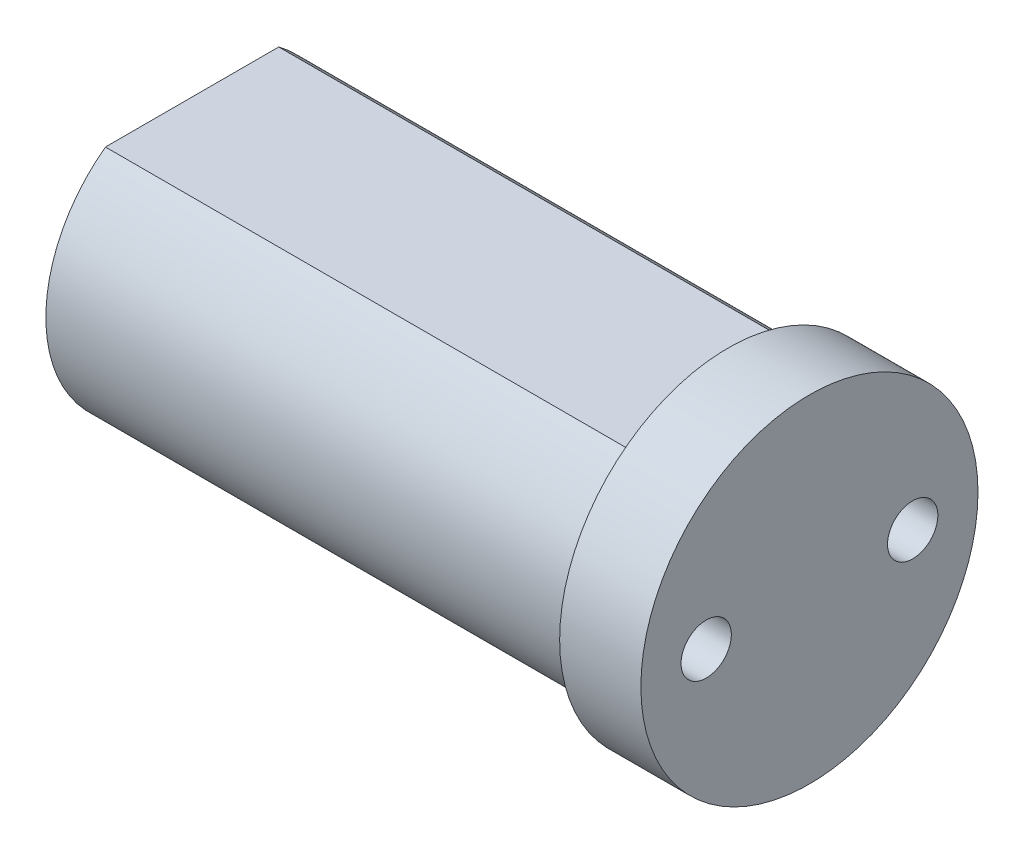
ISO-10303-21;
HEADER;
FILE_DESCRIPTION(('STEP AP214'),'2;1');
FILE_NAME('part.step','',(''),(''),'','','');
FILE_SCHEMA(('AUTOMOTIVE_DESIGN { 1 0 10303 214 1 1 1 1 }'));
ENDSEC;
DATA;
#1=APPLICATION_CONTEXT('core data for automotive mechanical design processes');
#2=APPLICATION_PROTOCOL_DEFINITION('international standard','automotive_design',2000,#1);
#3=PRODUCT_CONTEXT('',#1,'mechanical');
#4=PRODUCT('Part','Part','',(#3));
#5=PRODUCT_RELATED_PRODUCT_CATEGORY('part','',(#4));
#6=PRODUCT_DEFINITION_FORMATION('','',#4);
#7=PRODUCT_DEFINITION_CONTEXT('part definition',#1,'design');
#8=PRODUCT_DEFINITION('design','',#6,#7);
#9=PRODUCT_DEFINITION_SHAPE('','',#8);
#10=(LENGTH_UNIT() NAMED_UNIT(*) SI_UNIT(.MILLI.,.METRE.));
#11=(NAMED_UNIT(*) PLANE_ANGLE_UNIT() SI_UNIT($,.RADIAN.));
#12=(NAMED_UNIT(*) SI_UNIT($,.STERADIAN.) SOLID_ANGLE_UNIT());
#13=UNCERTAINTY_MEASURE_WITH_UNIT(LENGTH_MEASURE(1.E-05),#10,'distance_accuracy_value','');
#14=(GEOMETRIC_REPRESENTATION_CONTEXT(3) GLOBAL_UNCERTAINTY_ASSIGNED_CONTEXT((#13)) GLOBAL_UNIT_ASSIGNED_CONTEXT((#10,
#11,#12)) REPRESENTATION_CONTEXT('',''));
#15=CARTESIAN_POINT('',(0.,0.,0.));
#16=DIRECTION('',(0.,0.,1.));
#17=DIRECTION('',(1.,0.,0.));
#18=AXIS2_PLACEMENT_3D('',#15,#16,#17);
#19=CARTESIAN_POINT('',(0.,0.,0.));
#20=DIRECTION('',(1.,0.,0.));
#21=DIRECTION('',(0.,0.,-1.));
#22=AXIS2_PLACEMENT_3D('',#19,#20,#21);
#23=PLANE('',#22);
#24=CARTESIAN_POINT('',(0.,0.,0.));
#25=DIRECTION('',(1.,0.,0.));
#26=DIRECTION('',(0.,0.,-1.));
#27=AXIS2_PLACEMENT_3D('',#24,#25,#26);
#28=CIRCLE('',#27,4.15);
#29=CARTESIAN_POINT('',(0.,0.,-4.15));
#30=VERTEX_POINT('',#29);
#31=EDGE_CURVE('E38',#30,#30,#28,.T.);
#32=ORIENTED_EDGE('',*,*,#31,.F.);
#33=EDGE_LOOP('',(#32));
#34=FACE_BOUND('',#33,.T.);
#35=CARTESIAN_POINT('',(0.,0.,0.));
#36=DIRECTION('',(-1.,0.,0.));
#37=DIRECTION('',(0.,0.,-1.));
#38=AXIS2_PLACEMENT_3D('',#35,#36,#37);
#39=CIRCLE('',#38,3.6);
#40=CARTESIAN_POINT('',(0.,-2.9,2.13307290077015));
#41=VERTEX_POINT('',#40);
#42=CARTESIAN_POINT('',(0.,2.9,2.13307290077015));
#43=VERTEX_POINT('',#42);
#44=EDGE_CURVE('E49',#41,#43,#39,.T.);
#45=ORIENTED_EDGE('',*,*,#44,.F.);
#46=DIRECTION('',(0.,0.,1.));
#47=VECTOR('',#46,1.);
#48=CARTESIAN_POINT('',(0.,-2.9,2.13307290077015));
#49=LINE('',#48,#47);
#50=CARTESIAN_POINT('',(0.,-2.9,-2.13307290077015));
#51=VERTEX_POINT('',#50);
#52=EDGE_CURVE('E53',#51,#41,#49,.T.);
#53=ORIENTED_EDGE('',*,*,#52,.F.);
#54=CARTESIAN_POINT('',(0.,0.,0.));
#55=DIRECTION('',(-1.,0.,0.));
#56=DIRECTION('',(0.,0.,-1.));
#57=AXIS2_PLACEMENT_3D('',#54,#55,#56);
#58=CIRCLE('',#57,3.6);
#59=CARTESIAN_POINT('',(0.,2.9,-2.13307290077015));
#60=VERTEX_POINT('',#59);
#61=EDGE_CURVE('E105',#60,#51,#58,.T.);
#62=ORIENTED_EDGE('',*,*,#61,.F.);
#63=DIRECTION('',(0.,0.,-1.));
#64=VECTOR('',#63,1.);
#65=CARTESIAN_POINT('',(0.,2.9,2.13307290077015));
#66=LINE('',#65,#64);
#67=EDGE_CURVE('E107',#43,#60,#66,.T.);
#68=ORIENTED_EDGE('',*,*,#67,.F.);
#69=EDGE_LOOP('',(#45,#53,#62,#68));
#70=FACE_BOUND('',#69,.T.);
#71=ADVANCED_FACE('F34',(#34,#70),#23,.F.);
#72=CARTESIAN_POINT('',(2.,0.,0.));
#73=DIRECTION('',(-1.,0.,0.));
#74=DIRECTION('',(0.,0.,1.));
#75=AXIS2_PLACEMENT_3D('',#72,#73,#74);
#76=CYLINDRICAL_SURFACE('',#75,4.15);
#77=CARTESIAN_POINT('',(2.,0.,0.));
#78=DIRECTION('',(1.,0.,0.));
#79=DIRECTION('',(0.,0.,-1.));
#80=AXIS2_PLACEMENT_3D('',#77,#78,#79);
#81=CIRCLE('',#80,4.15);
#82=CARTESIAN_POINT('',(2.,0.,-4.15));
#83=VERTEX_POINT('',#82);
#84=EDGE_CURVE('E11',#83,#83,#81,.T.);
#85=ORIENTED_EDGE('',*,*,#84,.F.);
#86=EDGE_LOOP('',(#85));
#87=FACE_BOUND('',#86,.T.);
#88=ORIENTED_EDGE('',*,*,#31,.T.);
#89=EDGE_LOOP('',(#88));
#90=FACE_BOUND('',#89,.T.);
#91=ADVANCED_FACE('F36',(#87,#90),#76,.T.);
#92=CARTESIAN_POINT('',(2.,0.,0.));
#93=DIRECTION('',(1.,0.,0.));
#94=DIRECTION('',(0.,0.,-1.));
#95=AXIS2_PLACEMENT_3D('',#92,#93,#94);
#96=PLANE('',#95);
#97=CARTESIAN_POINT('',(2.,0.,2.54193322109989));
#98=DIRECTION('',(1.,0.,0.));
#99=DIRECTION('',(0.,0.,-1.));
#100=AXIS2_PLACEMENT_3D('',#97,#98,#99);
#101=CIRCLE('',#100,0.619261524829767);
#102=CARTESIAN_POINT('',(2.,0.,1.92267169627012));
#103=VERTEX_POINT('',#102);
#104=EDGE_CURVE('E116',#103,#103,#101,.T.);
#105=ORIENTED_EDGE('',*,*,#104,.F.);
#106=EDGE_LOOP('',(#105));
#107=FACE_BOUND('',#106,.T.);
#108=CARTESIAN_POINT('',(2.,0.,-2.54193322109989));
#109=DIRECTION('',(1.,0.,0.));
#110=DIRECTION('',(0.,0.,1.));
#111=AXIS2_PLACEMENT_3D('',#108,#109,#110);
#112=CIRCLE('',#111,0.619261524829767);
#113=CARTESIAN_POINT('',(2.,0.,-1.92267169627012));
#114=VERTEX_POINT('',#113);
#115=EDGE_CURVE('E117',#114,#114,#112,.T.);
#116=ORIENTED_EDGE('',*,*,#115,.F.);
#117=EDGE_LOOP('',(#116));
#118=FACE_BOUND('',#117,.T.);
#119=ORIENTED_EDGE('',*,*,#84,.T.);
#120=EDGE_LOOP('',(#119));
#121=FACE_BOUND('',#120,.T.);
#122=ADVANCED_FACE('F127',(#107,#118,#121),#96,.T.);
#123=CARTESIAN_POINT('',(-13.2,0.,0.));
#124=DIRECTION('',(1.,0.,0.));
#125=DIRECTION('',(0.,0.,-1.));
#126=AXIS2_PLACEMENT_3D('',#123,#124,#125);
#127=CYLINDRICAL_SURFACE('',#126,3.6);
#128=ORIENTED_EDGE('',*,*,#44,.T.);
#129=DIRECTION('',(1.,0.,0.));
#130=VECTOR('',#129,1.);
#131=CARTESIAN_POINT('',(-13.2,2.9,2.13307290077015));
#132=LINE('',#131,#130);
#133=CARTESIAN_POINT('',(-13.2,2.9,2.13307290077015));
#134=VERTEX_POINT('',#133);
#135=EDGE_CURVE('E78',#134,#43,#132,.T.);
#136=ORIENTED_EDGE('',*,*,#135,.F.);
#137=CARTESIAN_POINT('',(-13.2,0.,0.));
#138=DIRECTION('',(-1.,0.,0.));
#139=DIRECTION('',(0.,0.,-1.));
#140=AXIS2_PLACEMENT_3D('',#137,#138,#139);
#141=CIRCLE('',#140,3.6);
#142=CARTESIAN_POINT('',(-13.2,-2.9,2.13307290077015));
#143=VERTEX_POINT('',#142);
#144=EDGE_CURVE('E84',#143,#134,#141,.T.);
#145=ORIENTED_EDGE('',*,*,#144,.F.);
#146=DIRECTION('',(1.,0.,0.));
#147=VECTOR('',#146,1.);
#148=CARTESIAN_POINT('',(-13.2,-2.9,2.13307290077015));
#149=LINE('',#148,#147);
#150=EDGE_CURVE('E102',#143,#41,#149,.T.);
#151=ORIENTED_EDGE('',*,*,#150,.T.);
#152=EDGE_LOOP('',(#128,#136,#145,#151));
#153=FACE_BOUND('',#152,.T.);
#154=ADVANCED_FACE('F94',(#153),#127,.T.);
#155=CARTESIAN_POINT('',(-13.2,2.9,2.13307290077015));
#156=DIRECTION('',(0.,-1.,0.));
#157=DIRECTION('',(0.,0.,-1.));
#158=AXIS2_PLACEMENT_3D('',#155,#156,#157);
#159=PLANE('',#158);
#160=ORIENTED_EDGE('',*,*,#67,.T.);
#161=DIRECTION('',(1.,0.,0.));
#162=VECTOR('',#161,1.);
#163=CARTESIAN_POINT('',(-13.2,2.9,-2.13307290077015));
#164=LINE('',#163,#162);
#165=CARTESIAN_POINT('',(-13.2,2.9,-2.13307290077015));
#166=VERTEX_POINT('',#165);
#167=EDGE_CURVE('E80',#166,#60,#164,.T.);
#168=ORIENTED_EDGE('',*,*,#167,.F.);
#169=DIRECTION('',(0.,0.,-1.));
#170=VECTOR('',#169,1.);
#171=CARTESIAN_POINT('',(-13.2,2.9,2.13307290077015));
#172=LINE('',#171,#170);
#173=EDGE_CURVE('E73',#134,#166,#172,.T.);
#174=ORIENTED_EDGE('',*,*,#173,.F.);
#175=ORIENTED_EDGE('',*,*,#135,.T.);
#176=EDGE_LOOP('',(#160,#168,#174,#175));
#177=FACE_BOUND('',#176,.T.);
#178=ADVANCED_FACE('F76',(#177),#159,.F.);
#179=CARTESIAN_POINT('',(-13.2,0.,0.));
#180=DIRECTION('',(1.,0.,0.));
#181=DIRECTION('',(0.,0.,-1.));
#182=AXIS2_PLACEMENT_3D('',#179,#180,#181);
#183=CYLINDRICAL_SURFACE('',#182,3.6);
#184=ORIENTED_EDGE('',*,*,#61,.T.);
#185=DIRECTION('',(1.,0.,0.));
#186=VECTOR('',#185,1.);
#187=CARTESIAN_POINT('',(-13.2,-2.9,-2.13307290077015));
#188=LINE('',#187,#186);
#189=CARTESIAN_POINT('',(-13.2,-2.9,-2.13307290077015));
#190=VERTEX_POINT('',#189);
#191=EDGE_CURVE('E97',#190,#51,#188,.T.);
#192=ORIENTED_EDGE('',*,*,#191,.F.);
#193=CARTESIAN_POINT('',(-13.2,0.,0.));
#194=DIRECTION('',(-1.,0.,0.));
#195=DIRECTION('',(0.,0.,-1.));
#196=AXIS2_PLACEMENT_3D('',#193,#194,#195);
#197=CIRCLE('',#196,3.6);
#198=EDGE_CURVE('E83',#166,#190,#197,.T.);
#199=ORIENTED_EDGE('',*,*,#198,.F.);
#200=ORIENTED_EDGE('',*,*,#167,.T.);
#201=EDGE_LOOP('',(#184,#192,#199,#200));
#202=FACE_BOUND('',#201,.T.);
#203=ADVANCED_FACE('F147',(#202),#183,.T.);
#204=CARTESIAN_POINT('',(-13.2,-2.9,2.13307290077015));
#205=DIRECTION('',(0.,1.,0.));
#206=DIRECTION('',(0.,0.,1.));
#207=AXIS2_PLACEMENT_3D('',#204,#205,#206);
#208=PLANE('',#207);
#209=ORIENTED_EDGE('',*,*,#52,.T.);
#210=ORIENTED_EDGE('',*,*,#150,.F.);
#211=DIRECTION('',(0.,0.,1.));
#212=VECTOR('',#211,1.);
#213=CARTESIAN_POINT('',(-13.2,-2.9,2.13307290077015));
#214=LINE('',#213,#212);
#215=EDGE_CURVE('E89',#190,#143,#214,.T.);
#216=ORIENTED_EDGE('',*,*,#215,.F.);
#217=ORIENTED_EDGE('',*,*,#191,.T.);
#218=EDGE_LOOP('',(#209,#210,#216,#217));
#219=FACE_BOUND('',#218,.T.);
#220=ADVANCED_FACE('F150',(#219),#208,.F.);
#221=CARTESIAN_POINT('',(-13.2,0.,0.));
#222=DIRECTION('',(1.,0.,0.));
#223=DIRECTION('',(0.,0.,-1.));
#224=AXIS2_PLACEMENT_3D('',#221,#222,#223);
#225=PLANE('',#224);
#226=CARTESIAN_POINT('',(-13.2,0.,2.54193322109989));
#227=DIRECTION('',(1.,0.,0.));
#228=DIRECTION('',(0.,0.,-1.));
#229=AXIS2_PLACEMENT_3D('',#226,#227,#228);
#230=CIRCLE('',#229,0.619261524829767);
#231=CARTESIAN_POINT('',(-13.2,0.,1.92267169627012));
#232=VERTEX_POINT('',#231);
#233=EDGE_CURVE('E110',#232,#232,#230,.T.);
#234=ORIENTED_EDGE('',*,*,#233,.T.);
#235=EDGE_LOOP('',(#234));
#236=FACE_BOUND('',#235,.T.);
#237=CARTESIAN_POINT('',(-13.2,0.,-2.54193322109989));
#238=DIRECTION('',(1.,0.,0.));
#239=DIRECTION('',(0.,0.,1.));
#240=AXIS2_PLACEMENT_3D('',#237,#238,#239);
#241=CIRCLE('',#240,0.619261524829767);
#242=CARTESIAN_POINT('',(-13.2,0.,-1.92267169627012));
#243=VERTEX_POINT('',#242);
#244=EDGE_CURVE('E113',#243,#243,#241,.T.);
#245=ORIENTED_EDGE('',*,*,#244,.T.);
#246=EDGE_LOOP('',(#245));
#247=FACE_BOUND('',#246,.T.);
#248=ORIENTED_EDGE('',*,*,#144,.T.);
#249=ORIENTED_EDGE('',*,*,#173,.T.);
#250=ORIENTED_EDGE('',*,*,#198,.T.);
#251=ORIENTED_EDGE('',*,*,#215,.T.);
#252=EDGE_LOOP('',(#248,#249,#250,#251));
#253=FACE_BOUND('',#252,.T.);
#254=ADVANCED_FACE('F87',(#236,#247,#253),#225,.F.);
#255=CARTESIAN_POINT('',(-13.2,0.,-2.54193322109989));
#256=DIRECTION('',(1.,0.,0.));
#257=DIRECTION('',(0.,0.,-1.));
#258=AXIS2_PLACEMENT_3D('',#255,#256,#257);
#259=CYLINDRICAL_SURFACE('',#258,0.619261524829767);
#260=ORIENTED_EDGE('',*,*,#244,.F.);
#261=EDGE_LOOP('',(#260));
#262=FACE_BOUND('',#261,.T.);
#263=ORIENTED_EDGE('',*,*,#115,.T.);
#264=EDGE_LOOP('',(#263));
#265=FACE_BOUND('',#264,.T.);
#266=ADVANCED_FACE('F157',(#262,#265),#259,.F.);
#267=CARTESIAN_POINT('',(-13.2,0.,2.54193322109989));
#268=DIRECTION('',(1.,0.,0.));
#269=DIRECTION('',(0.,0.,-1.));
#270=AXIS2_PLACEMENT_3D('',#267,#268,#269);
#271=CYLINDRICAL_SURFACE('',#270,0.619261524829767);
#272=ORIENTED_EDGE('',*,*,#233,.F.);
#273=EDGE_LOOP('',(#272));
#274=FACE_BOUND('',#273,.T.);
#275=ORIENTED_EDGE('',*,*,#104,.T.);
#276=EDGE_LOOP('',(#275));
#277=FACE_BOUND('',#276,.T.);
#278=ADVANCED_FACE('F125',(#274,#277),#271,.F.);
#279=CLOSED_SHELL('',(#71,#91,#122,#154,#178,#203,#220,#254,#266,#278));
#280=MANIFOLD_SOLID_BREP('B2',#279);
#281=ADVANCED_BREP_SHAPE_REPRESENTATION('',(#18,#280),#14);
#282=SHAPE_DEFINITION_REPRESENTATION(#9,#281);
ENDSEC;
END-ISO-10303-21;
